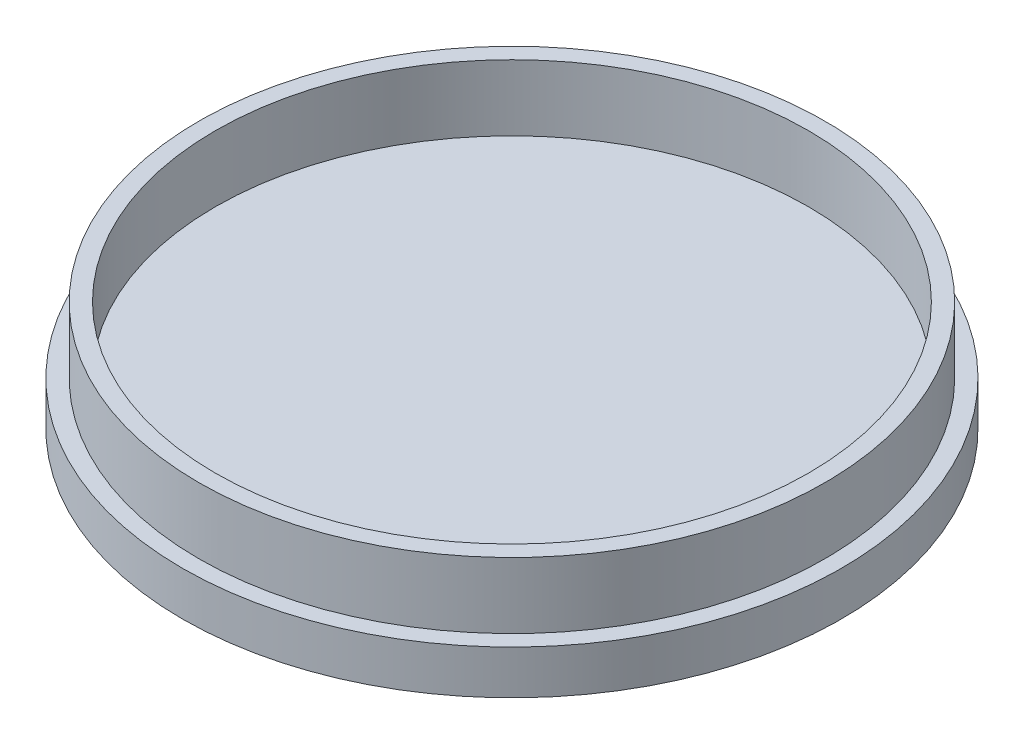
ISO-10303-21;
HEADER;
FILE_DESCRIPTION(('STEP AP214'),'2;1');
FILE_NAME('part.step','',(''),(''),'','','');
FILE_SCHEMA(('AUTOMOTIVE_DESIGN { 1 0 10303 214 1 1 1 1 }'));
ENDSEC;
DATA;
#1=APPLICATION_CONTEXT('core data for automotive mechanical design processes');
#2=APPLICATION_PROTOCOL_DEFINITION('international standard','automotive_design',2000,#1);
#3=PRODUCT_CONTEXT('',#1,'mechanical');
#4=PRODUCT('Part','Part','',(#3));
#5=PRODUCT_RELATED_PRODUCT_CATEGORY('part','',(#4));
#6=PRODUCT_DEFINITION_FORMATION('','',#4);
#7=PRODUCT_DEFINITION_CONTEXT('part definition',#1,'design');
#8=PRODUCT_DEFINITION('design','',#6,#7);
#9=PRODUCT_DEFINITION_SHAPE('','',#8);
#10=(LENGTH_UNIT() NAMED_UNIT(*) SI_UNIT(.MILLI.,.METRE.));
#11=(NAMED_UNIT(*) PLANE_ANGLE_UNIT() SI_UNIT($,.RADIAN.));
#12=(NAMED_UNIT(*) SI_UNIT($,.STERADIAN.) SOLID_ANGLE_UNIT());
#13=UNCERTAINTY_MEASURE_WITH_UNIT(LENGTH_MEASURE(1.E-05),#10,'distance_accuracy_value','');
#14=(GEOMETRIC_REPRESENTATION_CONTEXT(3) GLOBAL_UNCERTAINTY_ASSIGNED_CONTEXT((#13)) GLOBAL_UNIT_ASSIGNED_CONTEXT((#10,
#11,#12)) REPRESENTATION_CONTEXT('',''));
#15=CARTESIAN_POINT('',(0.,0.,0.));
#16=DIRECTION('',(0.,0.,1.));
#17=DIRECTION('',(1.,0.,0.));
#18=AXIS2_PLACEMENT_3D('',#15,#16,#17);
#19=CARTESIAN_POINT('',(0.,0.,0.));
#20=DIRECTION('',(0.,1.,0.));
#21=DIRECTION('',(0.,0.,1.));
#22=AXIS2_PLACEMENT_3D('',#19,#20,#21);
#23=PLANE('',#22);
#24=CARTESIAN_POINT('',(0.,0.,0.));
#25=DIRECTION('',(0.,1.,0.));
#26=DIRECTION('',(0.,0.,1.));
#27=AXIS2_PLACEMENT_3D('',#24,#25,#26);
#28=CIRCLE('',#27,15.);
#29=CARTESIAN_POINT('',(0.,0.,15.));
#30=VERTEX_POINT('',#29);
#31=EDGE_CURVE('E88',#30,#30,#28,.T.);
#32=ORIENTED_EDGE('',*,*,#31,.F.);
#33=EDGE_LOOP('',(#32));
#34=FACE_BOUND('',#33,.T.);
#35=CARTESIAN_POINT('',(0.,0.,3.5));
#36=DIRECTION('',(0.,-1.,0.));
#37=DIRECTION('',(0.,0.,-1.));
#38=AXIS2_PLACEMENT_3D('',#35,#36,#37);
#39=CIRCLE('',#38,0.5);
#40=CARTESIAN_POINT('',(0.,0.,3.));
#41=VERTEX_POINT('',#40);
#42=EDGE_CURVE('E10',#41,#41,#39,.T.);
#43=ORIENTED_EDGE('',*,*,#42,.F.);
#44=EDGE_LOOP('',(#43));
#45=FACE_BOUND('',#44,.T.);
#46=CARTESIAN_POINT('',(0.,0.,-3.5));
#47=DIRECTION('',(0.,1.,0.));
#48=DIRECTION('',(0.,0.,1.));
#49=AXIS2_PLACEMENT_3D('',#46,#47,#48);
#50=CIRCLE('',#49,0.5);
#51=CARTESIAN_POINT('',(0.,0.,-3.));
#52=VERTEX_POINT('',#51);
#53=EDGE_CURVE('E75',#52,#52,#50,.T.);
#54=ORIENTED_EDGE('',*,*,#53,.T.);
#55=EDGE_LOOP('',(#54));
#56=FACE_BOUND('',#55,.T.);
#57=ADVANCED_FACE('F43',(#34,#45,#56),#23,.F.);
#58=CARTESIAN_POINT('',(0.,2.,0.));
#59=DIRECTION('',(0.,-1.,0.));
#60=DIRECTION('',(0.,0.,-1.));
#61=AXIS2_PLACEMENT_3D('',#58,#59,#60);
#62=CYLINDRICAL_SURFACE('',#61,15.);
#63=CARTESIAN_POINT('',(0.,2.,0.));
#64=DIRECTION('',(0.,1.,0.));
#65=DIRECTION('',(0.,0.,1.));
#66=AXIS2_PLACEMENT_3D('',#63,#64,#65);
#67=CIRCLE('',#66,15.);
#68=CARTESIAN_POINT('',(0.,2.,15.));
#69=VERTEX_POINT('',#68);
#70=EDGE_CURVE('E59',#69,#69,#67,.T.);
#71=ORIENTED_EDGE('',*,*,#70,.F.);
#72=EDGE_LOOP('',(#71));
#73=FACE_BOUND('',#72,.T.);
#74=ORIENTED_EDGE('',*,*,#31,.T.);
#75=EDGE_LOOP('',(#74));
#76=FACE_BOUND('',#75,.T.);
#77=ADVANCED_FACE('F45',(#73,#76),#62,.T.);
#78=CARTESIAN_POINT('',(0.,2.,0.));
#79=DIRECTION('',(0.,1.,0.));
#80=DIRECTION('',(0.,0.,1.));
#81=AXIS2_PLACEMENT_3D('',#78,#79,#80);
#82=PLANE('',#81);
#83=CARTESIAN_POINT('',(0.,2.,0.));
#84=DIRECTION('',(0.,1.,0.));
#85=DIRECTION('',(0.,0.,1.));
#86=AXIS2_PLACEMENT_3D('',#83,#84,#85);
#87=CIRCLE('',#86,14.25);
#88=CARTESIAN_POINT('',(0.,2.,14.25));
#89=VERTEX_POINT('',#88);
#90=EDGE_CURVE('E83',#89,#89,#87,.T.);
#91=ORIENTED_EDGE('',*,*,#90,.F.);
#92=EDGE_LOOP('',(#91));
#93=FACE_BOUND('',#92,.T.);
#94=ORIENTED_EDGE('',*,*,#70,.T.);
#95=EDGE_LOOP('',(#94));
#96=FACE_BOUND('',#95,.T.);
#97=ADVANCED_FACE('F139',(#93,#96),#82,.T.);
#98=CARTESIAN_POINT('',(0.,5.,0.));
#99=DIRECTION('',(0.,1.,0.));
#100=DIRECTION('',(0.,0.,1.));
#101=AXIS2_PLACEMENT_3D('',#98,#99,#100);
#102=PLANE('',#101);
#103=CARTESIAN_POINT('',(0.,5.,0.));
#104=DIRECTION('',(0.,1.,0.));
#105=DIRECTION('',(0.,0.,1.));
#106=AXIS2_PLACEMENT_3D('',#103,#104,#105);
#107=CIRCLE('',#106,14.25);
#108=CARTESIAN_POINT('',(0.,5.,14.25));
#109=VERTEX_POINT('',#108);
#110=EDGE_CURVE('E84',#109,#109,#107,.T.);
#111=ORIENTED_EDGE('',*,*,#110,.T.);
#112=EDGE_LOOP('',(#111));
#113=FACE_BOUND('',#112,.T.);
#114=CARTESIAN_POINT('',(0.,5.,0.));
#115=DIRECTION('',(0.,1.,0.));
#116=DIRECTION('',(0.,0.,1.));
#117=AXIS2_PLACEMENT_3D('',#114,#115,#116);
#118=CIRCLE('',#117,13.5);
#119=CARTESIAN_POINT('',(0.,5.,13.5));
#120=VERTEX_POINT('',#119);
#121=EDGE_CURVE('E79',#120,#120,#118,.T.);
#122=ORIENTED_EDGE('',*,*,#121,.F.);
#123=EDGE_LOOP('',(#122));
#124=FACE_BOUND('',#123,.T.);
#125=ADVANCED_FACE('F145',(#113,#124),#102,.T.);
#126=CARTESIAN_POINT('',(0.,5.,0.));
#127=DIRECTION('',(0.,-1.,0.));
#128=DIRECTION('',(0.,0.,-1.));
#129=AXIS2_PLACEMENT_3D('',#126,#127,#128);
#130=CYLINDRICAL_SURFACE('',#129,14.25);
#131=ORIENTED_EDGE('',*,*,#110,.F.);
#132=EDGE_LOOP('',(#131));
#133=FACE_BOUND('',#132,.T.);
#134=ORIENTED_EDGE('',*,*,#90,.T.);
#135=EDGE_LOOP('',(#134));
#136=FACE_BOUND('',#135,.T.);
#137=ADVANCED_FACE('F143',(#133,#136),#130,.T.);
#138=CARTESIAN_POINT('',(0.,5.,0.));
#139=DIRECTION('',(0.,-1.,0.));
#140=DIRECTION('',(0.,0.,-1.));
#141=AXIS2_PLACEMENT_3D('',#138,#139,#140);
#142=CYLINDRICAL_SURFACE('',#141,13.5);
#143=ORIENTED_EDGE('',*,*,#121,.T.);
#144=EDGE_LOOP('',(#143));
#145=FACE_BOUND('',#144,.T.);
#146=CARTESIAN_POINT('',(0.,2.,0.));
#147=DIRECTION('',(0.,1.,0.));
#148=DIRECTION('',(0.,0.,1.));
#149=AXIS2_PLACEMENT_3D('',#146,#147,#148);
#150=CIRCLE('',#149,13.5);
#151=CARTESIAN_POINT('',(0.,2.,13.5));
#152=VERTEX_POINT('',#151);
#153=EDGE_CURVE('E47',#152,#152,#150,.F.);
#154=ORIENTED_EDGE('',*,*,#153,.T.);
#155=EDGE_LOOP('',(#154));
#156=FACE_BOUND('',#155,.T.);
#157=ADVANCED_FACE('F136',(#145,#156),#142,.F.);
#158=ORIENTED_EDGE('',*,*,#153,.F.);
#159=EDGE_LOOP('',(#158));
#160=FACE_BOUND('',#159,.T.);
#161=ADVANCED_FACE('F109',(#160),#82,.T.);
#162=CARTESIAN_POINT('',(0.,0.,3.5));
#163=DIRECTION('',(0.,-1.,0.));
#164=DIRECTION('',(0.,0.,-1.));
#165=AXIS2_PLACEMENT_3D('',#162,#163,#164);
#166=CYLINDRICAL_SURFACE('',#165,0.5);
#167=CARTESIAN_POINT('',(0.,-0.999999999999993,3.5));
#168=DIRECTION('',(0.,-1.,0.));
#169=DIRECTION('',(0.,0.,-1.));
#170=AXIS2_PLACEMENT_3D('',#167,#168,#169);
#171=CIRCLE('',#170,0.5);
#172=CARTESIAN_POINT('',(0.,-0.99999999999999,4.));
#173=VERTEX_POINT('',#172);
#174=EDGE_CURVE('E61',#173,#173,#171,.T.);
#175=ORIENTED_EDGE('',*,*,#174,.F.);
#176=EDGE_LOOP('',(#175));
#177=FACE_BOUND('',#176,.T.);
#178=ORIENTED_EDGE('',*,*,#42,.T.);
#179=EDGE_LOOP('',(#178));
#180=FACE_BOUND('',#179,.T.);
#181=ADVANCED_FACE('F126',(#177,#180),#166,.T.);
#182=CARTESIAN_POINT('',(0.,-1.,2.5));
#183=DIRECTION('',(1.,0.,0.));
#184=DIRECTION('',(0.,0.,-1.));
#185=AXIS2_PLACEMENT_3D('',#182,#183,#184);
#186=TOROIDAL_SURFACE('',#185,1.,0.5);
#187=CARTESIAN_POINT('',(0.,-2.,2.49999999999999));
#188=DIRECTION('',(0.,0.,-1.));
#189=DIRECTION('',(0.,1.,0.));
#190=AXIS2_PLACEMENT_3D('',#187,#188,#189);
#191=CIRCLE('',#190,0.5);
#192=CARTESIAN_POINT('',(0.,-2.5,2.49999999999999));
#193=VERTEX_POINT('',#192);
#194=EDGE_CURVE('E64',#193,#193,#191,.T.);
#195=CARTESIAN_POINT('',(0.,-1.,2.5));
#196=DIRECTION('',(1.,0.,0.));
#197=DIRECTION('',(0.,0.,-1.));
#198=AXIS2_PLACEMENT_3D('',#195,#196,#197);
#199=CIRCLE('',#198,1.5);
#200=EDGE_CURVE('',#173,#193,#199,.T.);
#201=ORIENTED_EDGE('',*,*,#174,.T.);
#202=ORIENTED_EDGE('',*,*,#194,.F.);
#203=ORIENTED_EDGE('',*,*,#200,.T.);
#204=ORIENTED_EDGE('',*,*,#200,.F.);
#205=EDGE_LOOP('',(#201,#203,#202,#204));
#206=FACE_BOUND('',#205,.T.);
#207=ADVANCED_FACE('F120',(#206),#186,.T.);
#208=CARTESIAN_POINT('',(0.,-2.,2.49999999999999));
#209=DIRECTION('',(0.,0.,-1.));
#210=DIRECTION('',(0.,1.,0.));
#211=AXIS2_PLACEMENT_3D('',#208,#209,#210);
#212=CYLINDRICAL_SURFACE('',#211,0.5);
#213=CARTESIAN_POINT('',(0.,-2.,-2.49999999999999));
#214=DIRECTION('',(0.,0.,-1.));
#215=DIRECTION('',(0.,1.,0.));
#216=AXIS2_PLACEMENT_3D('',#213,#214,#215);
#217=CIRCLE('',#216,0.5);
#218=CARTESIAN_POINT('',(0.,-2.5,-2.49999999999999));
#219=VERTEX_POINT('',#218);
#220=EDGE_CURVE('E68',#219,#219,#217,.T.);
#221=ORIENTED_EDGE('',*,*,#220,.F.);
#222=EDGE_LOOP('',(#221));
#223=FACE_BOUND('',#222,.T.);
#224=ORIENTED_EDGE('',*,*,#194,.T.);
#225=EDGE_LOOP('',(#224));
#226=FACE_BOUND('',#225,.T.);
#227=ADVANCED_FACE('F114',(#223,#226),#212,.T.);
#228=CARTESIAN_POINT('',(0.,-1.,-2.5));
#229=DIRECTION('',(1.,0.,0.));
#230=DIRECTION('',(0.,0.,-1.));
#231=AXIS2_PLACEMENT_3D('',#228,#229,#230);
#232=TOROIDAL_SURFACE('',#231,0.999999999999999,0.5);
#233=CARTESIAN_POINT('',(0.,-1.,-3.5));
#234=DIRECTION('',(0.,1.,0.));
#235=DIRECTION('',(0.,0.,1.));
#236=AXIS2_PLACEMENT_3D('',#233,#234,#235);
#237=CIRCLE('',#236,0.5);
#238=CARTESIAN_POINT('',(0.,-1.,-4.));
#239=VERTEX_POINT('',#238);
#240=EDGE_CURVE('E72',#239,#239,#237,.T.);
#241=CARTESIAN_POINT('',(0.,-1.,-2.5));
#242=DIRECTION('',(1.,0.,0.));
#243=DIRECTION('',(0.,0.,-1.));
#244=AXIS2_PLACEMENT_3D('',#241,#242,#243);
#245=CIRCLE('',#244,1.5);
#246=EDGE_CURVE('',#219,#239,#245,.T.);
#247=ORIENTED_EDGE('',*,*,#220,.T.);
#248=ORIENTED_EDGE('',*,*,#240,.F.);
#249=ORIENTED_EDGE('',*,*,#246,.T.);
#250=ORIENTED_EDGE('',*,*,#246,.F.);
#251=EDGE_LOOP('',(#247,#249,#248,#250));
#252=FACE_BOUND('',#251,.T.);
#253=ADVANCED_FACE('F107',(#252),#232,.T.);
#254=CARTESIAN_POINT('',(0.,-1.,-3.5));
#255=DIRECTION('',(0.,1.,0.));
#256=DIRECTION('',(0.,0.,1.));
#257=AXIS2_PLACEMENT_3D('',#254,#255,#256);
#258=CYLINDRICAL_SURFACE('',#257,0.5);
#259=ORIENTED_EDGE('',*,*,#53,.F.);
#260=EDGE_LOOP('',(#259));
#261=FACE_BOUND('',#260,.T.);
#262=ORIENTED_EDGE('',*,*,#240,.T.);
#263=EDGE_LOOP('',(#262));
#264=FACE_BOUND('',#263,.T.);
#265=ADVANCED_FACE('F104',(#261,#264),#258,.T.);
#266=CLOSED_SHELL('',(#57,#77,#97,#125,#137,#157,#161,#181,#207,#227,#253,#265));
#267=MANIFOLD_SOLID_BREP('B2',#266);
#268=ADVANCED_BREP_SHAPE_REPRESENTATION('',(#18,#267),#14);
#269=SHAPE_DEFINITION_REPRESENTATION(#9,#268);
ENDSEC;
END-ISO-10303-21;
